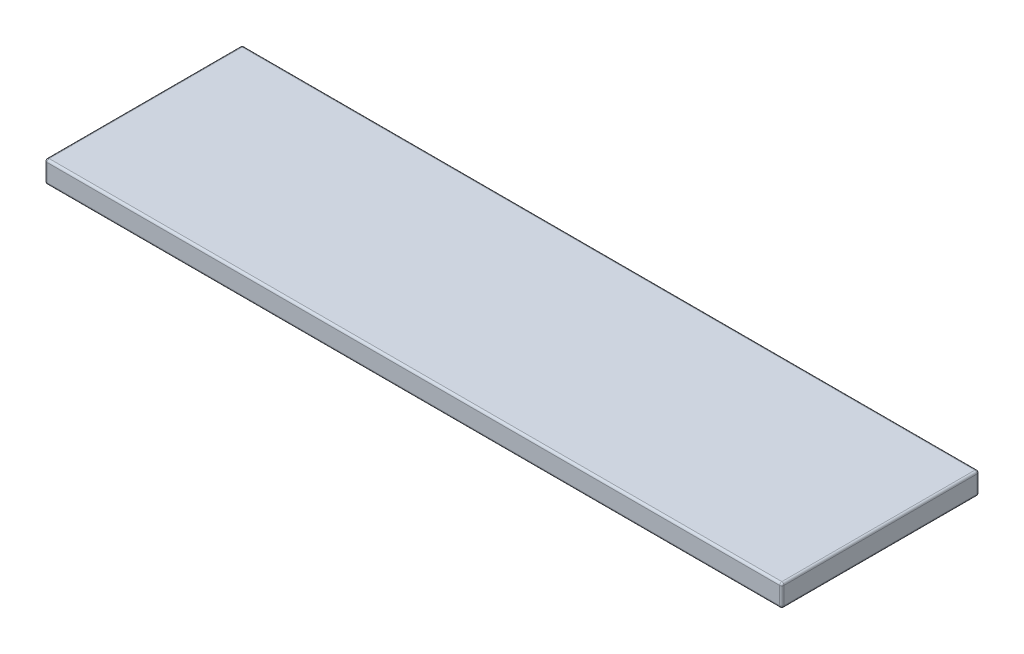
ISO-10303-21;
HEADER;
FILE_DESCRIPTION(('STEP AP214'),'2;1');
FILE_NAME('part.step','',(''),(''),'','','');
FILE_SCHEMA(('AUTOMOTIVE_DESIGN { 1 0 10303 214 1 1 1 1 }'));
ENDSEC;
DATA;
#1=APPLICATION_CONTEXT('core data for automotive mechanical design processes');
#2=APPLICATION_PROTOCOL_DEFINITION('international standard','automotive_design',2000,#1);
#3=PRODUCT_CONTEXT('',#1,'mechanical');
#4=PRODUCT('Part','Part','',(#3));
#5=PRODUCT_RELATED_PRODUCT_CATEGORY('part','',(#4));
#6=PRODUCT_DEFINITION_FORMATION('','',#4);
#7=PRODUCT_DEFINITION_CONTEXT('part definition',#1,'design');
#8=PRODUCT_DEFINITION('design','',#6,#7);
#9=PRODUCT_DEFINITION_SHAPE('','',#8);
#10=(LENGTH_UNIT() NAMED_UNIT(*) SI_UNIT(.MILLI.,.METRE.));
#11=(NAMED_UNIT(*) PLANE_ANGLE_UNIT() SI_UNIT($,.RADIAN.));
#12=(NAMED_UNIT(*) SI_UNIT($,.STERADIAN.) SOLID_ANGLE_UNIT());
#13=UNCERTAINTY_MEASURE_WITH_UNIT(LENGTH_MEASURE(1.E-05),#10,'distance_accuracy_value','');
#14=(GEOMETRIC_REPRESENTATION_CONTEXT(3) GLOBAL_UNCERTAINTY_ASSIGNED_CONTEXT((#13)) GLOBAL_UNIT_ASSIGNED_CONTEXT((#10,
#11,#12)) REPRESENTATION_CONTEXT('',''));
#15=CARTESIAN_POINT('',(0.,0.,0.));
#16=DIRECTION('',(0.,0.,1.));
#17=DIRECTION('',(1.,0.,0.));
#18=AXIS2_PLACEMENT_3D('',#15,#16,#17);
#19=CARTESIAN_POINT('',(84.,5.,22.5));
#20=DIRECTION('',(-1.,0.,0.));
#21=DIRECTION('',(0.,0.,1.));
#22=AXIS2_PLACEMENT_3D('',#19,#20,#21);
#23=PLANE('',#22);
#24=DIRECTION('',(0.,-1.,0.));
#25=VECTOR('',#24,1.);
#26=CARTESIAN_POINT('',(84.,5.,-22.));
#27=LINE('',#26,#25);
#28=CARTESIAN_POINT('',(84.,0.5,-22.));
#29=VERTEX_POINT('',#28);
#30=CARTESIAN_POINT('',(84.,4.5,-22.));
#31=VERTEX_POINT('',#30);
#32=EDGE_CURVE('E130',#29,#31,#27,.F.);
#33=ORIENTED_EDGE('',*,*,#32,.T.);
#34=DIRECTION('',(0.,0.,-1.));
#35=VECTOR('',#34,1.);
#36=CARTESIAN_POINT('',(84.,4.5,22.5));
#37=LINE('',#36,#35);
#38=CARTESIAN_POINT('',(84.,4.5,22.));
#39=VERTEX_POINT('',#38);
#40=EDGE_CURVE('E167',#31,#39,#37,.F.);
#41=ORIENTED_EDGE('',*,*,#40,.T.);
#42=DIRECTION('',(0.,-1.,0.));
#43=VECTOR('',#42,1.);
#44=CARTESIAN_POINT('',(84.,5.,22.));
#45=LINE('',#44,#43);
#46=CARTESIAN_POINT('',(84.,0.5,22.));
#47=VERTEX_POINT('',#46);
#48=EDGE_CURVE('E164',#39,#47,#45,.T.);
#49=ORIENTED_EDGE('',*,*,#48,.T.);
#50=DIRECTION('',(0.,0.,-1.));
#51=VECTOR('',#50,1.);
#52=CARTESIAN_POINT('',(84.,0.5,-22.5));
#53=LINE('',#52,#51);
#54=EDGE_CURVE('E159',#47,#29,#53,.T.);
#55=ORIENTED_EDGE('',*,*,#54,.T.);
#56=EDGE_LOOP('',(#33,#41,#49,#55));
#57=FACE_BOUND('',#56,.T.);
#58=ADVANCED_FACE('F34',(#57),#23,.F.);
#59=CARTESIAN_POINT('',(-84.,5.,-22.5));
#60=DIRECTION('',(0.,0.,1.));
#61=DIRECTION('',(1.,0.,0.));
#62=AXIS2_PLACEMENT_3D('',#59,#60,#61);
#63=PLANE('',#62);
#64=DIRECTION('',(0.,-1.,0.));
#65=VECTOR('',#64,1.);
#66=CARTESIAN_POINT('',(-83.5,5.,-22.5));
#67=LINE('',#66,#65);
#68=CARTESIAN_POINT('',(-83.5,0.5,-22.5));
#69=VERTEX_POINT('',#68);
#70=CARTESIAN_POINT('',(-83.5,4.5,-22.5));
#71=VERTEX_POINT('',#70);
#72=EDGE_CURVE('E152',#69,#71,#67,.F.);
#73=ORIENTED_EDGE('',*,*,#72,.T.);
#74=DIRECTION('',(-1.,0.,0.));
#75=VECTOR('',#74,1.);
#76=CARTESIAN_POINT('',(-84.,4.5,-22.5));
#77=LINE('',#76,#75);
#78=CARTESIAN_POINT('',(83.5,4.5,-22.5));
#79=VERTEX_POINT('',#78);
#80=EDGE_CURVE('E156',#71,#79,#77,.F.);
#81=ORIENTED_EDGE('',*,*,#80,.T.);
#82=DIRECTION('',(0.,-1.,0.));
#83=VECTOR('',#82,1.);
#84=CARTESIAN_POINT('',(83.5,5.,-22.5));
#85=LINE('',#84,#83);
#86=CARTESIAN_POINT('',(83.5,0.5,-22.5));
#87=VERTEX_POINT('',#86);
#88=EDGE_CURVE('E128',#79,#87,#85,.T.);
#89=ORIENTED_EDGE('',*,*,#88,.T.);
#90=DIRECTION('',(-1.,0.,0.));
#91=VECTOR('',#90,1.);
#92=CARTESIAN_POINT('',(-84.,0.5,-22.5));
#93=LINE('',#92,#91);
#94=EDGE_CURVE('E146',#87,#69,#93,.T.);
#95=ORIENTED_EDGE('',*,*,#94,.T.);
#96=EDGE_LOOP('',(#73,#81,#89,#95));
#97=FACE_BOUND('',#96,.T.);
#98=ADVANCED_FACE('F154',(#97),#63,.F.);
#99=CARTESIAN_POINT('',(-84.,5.,22.5));
#100=DIRECTION('',(1.,0.,0.));
#101=DIRECTION('',(0.,0.,-1.));
#102=AXIS2_PLACEMENT_3D('',#99,#100,#101);
#103=PLANE('',#102);
#104=DIRECTION('',(0.,-1.,0.));
#105=VECTOR('',#104,1.);
#106=CARTESIAN_POINT('',(-84.,5.,22.));
#107=LINE('',#106,#105);
#108=CARTESIAN_POINT('',(-84.,0.5,22.));
#109=VERTEX_POINT('',#108);
#110=CARTESIAN_POINT('',(-84.,4.5,22.));
#111=VERTEX_POINT('',#110);
#112=EDGE_CURVE('E171',#109,#111,#107,.F.);
#113=ORIENTED_EDGE('',*,*,#112,.T.);
#114=DIRECTION('',(0.,0.,1.));
#115=VECTOR('',#114,1.);
#116=CARTESIAN_POINT('',(-84.,4.5,22.5));
#117=LINE('',#116,#115);
#118=CARTESIAN_POINT('',(-84.,4.5,-22.));
#119=VERTEX_POINT('',#118);
#120=EDGE_CURVE('E176',#111,#119,#117,.F.);
#121=ORIENTED_EDGE('',*,*,#120,.T.);
#122=DIRECTION('',(0.,-1.,0.));
#123=VECTOR('',#122,1.);
#124=CARTESIAN_POINT('',(-84.,5.,-22.));
#125=LINE('',#124,#123);
#126=CARTESIAN_POINT('',(-84.,0.5,-22.));
#127=VERTEX_POINT('',#126);
#128=EDGE_CURVE('E173',#119,#127,#125,.T.);
#129=ORIENTED_EDGE('',*,*,#128,.T.);
#130=DIRECTION('',(0.,0.,1.));
#131=VECTOR('',#130,1.);
#132=CARTESIAN_POINT('',(-84.,0.5,22.5));
#133=LINE('',#132,#131);
#134=EDGE_CURVE('E169',#127,#109,#133,.T.);
#135=ORIENTED_EDGE('',*,*,#134,.T.);
#136=EDGE_LOOP('',(#113,#121,#129,#135));
#137=FACE_BOUND('',#136,.T.);
#138=ADVANCED_FACE('F281',(#137),#103,.F.);
#139=CARTESIAN_POINT('',(-84.,5.,22.5));
#140=DIRECTION('',(0.,0.,-1.));
#141=DIRECTION('',(-1.,0.,0.));
#142=AXIS2_PLACEMENT_3D('',#139,#140,#141);
#143=PLANE('',#142);
#144=DIRECTION('',(0.,-1.,0.));
#145=VECTOR('',#144,1.);
#146=CARTESIAN_POINT('',(83.5,5.,22.5));
#147=LINE('',#146,#145);
#148=CARTESIAN_POINT('',(83.5,0.5,22.5));
#149=VERTEX_POINT('',#148);
#150=CARTESIAN_POINT('',(83.5,4.5,22.5));
#151=VERTEX_POINT('',#150);
#152=EDGE_CURVE('E180',#149,#151,#147,.F.);
#153=ORIENTED_EDGE('',*,*,#152,.T.);
#154=DIRECTION('',(1.,0.,0.));
#155=VECTOR('',#154,1.);
#156=CARTESIAN_POINT('',(-84.,4.5,22.5));
#157=LINE('',#156,#155);
#158=CARTESIAN_POINT('',(-83.5,4.5,22.5));
#159=VERTEX_POINT('',#158);
#160=EDGE_CURVE('E185',#151,#159,#157,.F.);
#161=ORIENTED_EDGE('',*,*,#160,.T.);
#162=DIRECTION('',(0.,-1.,0.));
#163=VECTOR('',#162,1.);
#164=CARTESIAN_POINT('',(-83.5,5.,22.5));
#165=LINE('',#164,#163);
#166=CARTESIAN_POINT('',(-83.5,0.5,22.5));
#167=VERTEX_POINT('',#166);
#168=EDGE_CURVE('E182',#159,#167,#165,.T.);
#169=ORIENTED_EDGE('',*,*,#168,.T.);
#170=DIRECTION('',(1.,0.,0.));
#171=VECTOR('',#170,1.);
#172=CARTESIAN_POINT('',(84.,0.5,22.5));
#173=LINE('',#172,#171);
#174=EDGE_CURVE('E178',#167,#149,#173,.T.);
#175=ORIENTED_EDGE('',*,*,#174,.T.);
#176=EDGE_LOOP('',(#153,#161,#169,#175));
#177=FACE_BOUND('',#176,.T.);
#178=ADVANCED_FACE('F292',(#177),#143,.F.);
#179=CARTESIAN_POINT('',(0.,5.,0.));
#180=DIRECTION('',(0.,-1.,0.));
#181=DIRECTION('',(0.,0.,-1.));
#182=AXIS2_PLACEMENT_3D('',#179,#180,#181);
#183=PLANE('',#182);
#184=DIRECTION('',(0.,0.,1.));
#185=VECTOR('',#184,1.);
#186=CARTESIAN_POINT('',(-83.5,5.,0.));
#187=LINE('',#186,#185);
#188=CARTESIAN_POINT('',(-83.5,5.,-22.));
#189=VERTEX_POINT('',#188);
#190=CARTESIAN_POINT('',(-83.5,5.,22.));
#191=VERTEX_POINT('',#190);
#192=EDGE_CURVE('E191',#189,#191,#187,.T.);
#193=ORIENTED_EDGE('',*,*,#192,.T.);
#194=DIRECTION('',(1.,0.,0.));
#195=VECTOR('',#194,1.);
#196=CARTESIAN_POINT('',(0.,5.,22.));
#197=LINE('',#196,#195);
#198=CARTESIAN_POINT('',(83.5,5.,22.));
#199=VERTEX_POINT('',#198);
#200=EDGE_CURVE('E193',#191,#199,#197,.T.);
#201=ORIENTED_EDGE('',*,*,#200,.T.);
#202=DIRECTION('',(0.,0.,-1.));
#203=VECTOR('',#202,1.);
#204=CARTESIAN_POINT('',(83.5,5.,0.));
#205=LINE('',#204,#203);
#206=CARTESIAN_POINT('',(83.5,5.,-22.));
#207=VERTEX_POINT('',#206);
#208=EDGE_CURVE('E187',#199,#207,#205,.T.);
#209=ORIENTED_EDGE('',*,*,#208,.T.);
#210=DIRECTION('',(-1.,0.,0.));
#211=VECTOR('',#210,1.);
#212=CARTESIAN_POINT('',(0.,5.,-22.));
#213=LINE('',#212,#211);
#214=EDGE_CURVE('E189',#207,#189,#213,.T.);
#215=ORIENTED_EDGE('',*,*,#214,.T.);
#216=EDGE_LOOP('',(#193,#201,#209,#215));
#217=FACE_BOUND('',#216,.T.);
#218=ADVANCED_FACE('F273',(#217),#183,.F.);
#219=CARTESIAN_POINT('',(0.,0.,0.));
#220=DIRECTION('',(0.,-1.,0.));
#221=DIRECTION('',(0.,0.,-1.));
#222=AXIS2_PLACEMENT_3D('',#219,#220,#221);
#223=PLANE('',#222);
#224=DIRECTION('',(0.,0.,1.));
#225=VECTOR('',#224,1.);
#226=CARTESIAN_POINT('',(-83.5,0.,-22.5));
#227=LINE('',#226,#225);
#228=CARTESIAN_POINT('',(-83.5,0.,22.));
#229=VERTEX_POINT('',#228);
#230=CARTESIAN_POINT('',(-83.5,0.,-22.));
#231=VERTEX_POINT('',#230);
#232=EDGE_CURVE('E43',#229,#231,#227,.F.);
#233=ORIENTED_EDGE('',*,*,#232,.T.);
#234=DIRECTION('',(-1.,0.,0.));
#235=VECTOR('',#234,1.);
#236=CARTESIAN_POINT('',(84.,0.,-22.));
#237=LINE('',#236,#235);
#238=CARTESIAN_POINT('',(83.5,0.,-22.));
#239=VERTEX_POINT('',#238);
#240=EDGE_CURVE('E11',#231,#239,#237,.F.);
#241=ORIENTED_EDGE('',*,*,#240,.T.);
#242=DIRECTION('',(0.,0.,-1.));
#243=VECTOR('',#242,1.);
#244=CARTESIAN_POINT('',(83.5,0.,22.5));
#245=LINE('',#244,#243);
#246=CARTESIAN_POINT('',(83.5,0.,22.));
#247=VERTEX_POINT('',#246);
#248=EDGE_CURVE('E196',#239,#247,#245,.F.);
#249=ORIENTED_EDGE('',*,*,#248,.T.);
#250=DIRECTION('',(1.,0.,0.));
#251=VECTOR('',#250,1.);
#252=CARTESIAN_POINT('',(-84.,0.,22.));
#253=LINE('',#252,#251);
#254=EDGE_CURVE('E54',#247,#229,#253,.F.);
#255=ORIENTED_EDGE('',*,*,#254,.T.);
#256=EDGE_LOOP('',(#233,#241,#249,#255));
#257=FACE_BOUND('',#256,.T.);
#258=ADVANCED_FACE('F479',(#257),#223,.T.);
#259=CARTESIAN_POINT('',(-83.5,5.,22.));
#260=DIRECTION('',(0.,-1.,0.));
#261=DIRECTION('',(0.,0.,-1.));
#262=AXIS2_PLACEMENT_3D('',#259,#260,#261);
#263=CYLINDRICAL_SURFACE('',#262,0.5);
#264=CARTESIAN_POINT('',(-83.5,4.5,22.));
#265=DIRECTION('',(0.,1.,0.));
#266=DIRECTION('',(0.,0.,1.));
#267=AXIS2_PLACEMENT_3D('',#264,#265,#266);
#268=CIRCLE('',#267,0.5);
#269=EDGE_CURVE('E38',#111,#159,#268,.T.);
#270=ORIENTED_EDGE('',*,*,#269,.F.);
#271=ORIENTED_EDGE('',*,*,#112,.F.);
#272=CARTESIAN_POINT('',(-83.5,0.5,22.));
#273=DIRECTION('',(0.,-1.,0.));
#274=DIRECTION('',(0.,0.,-1.));
#275=AXIS2_PLACEMENT_3D('',#272,#273,#274);
#276=CIRCLE('',#275,0.5);
#277=EDGE_CURVE('E250',#167,#109,#276,.T.);
#278=ORIENTED_EDGE('',*,*,#277,.F.);
#279=ORIENTED_EDGE('',*,*,#168,.F.);
#280=EDGE_LOOP('',(#270,#271,#278,#279));
#281=FACE_BOUND('',#280,.T.);
#282=ADVANCED_FACE('F36',(#281),#263,.T.);
#283=CARTESIAN_POINT('',(-83.5,4.5,22.));
#284=DIRECTION('',(0.,0.,1.));
#285=DIRECTION('',(1.,0.,0.));
#286=AXIS2_PLACEMENT_3D('',#283,#284,#285);
#287=SPHERICAL_SURFACE('',#286,0.5);
#288=CARTESIAN_POINT('',(-83.5,4.5,22.));
#289=DIRECTION('',(0.,0.,1.));
#290=DIRECTION('',(1.,0.,0.));
#291=AXIS2_PLACEMENT_3D('',#288,#289,#290);
#292=CIRCLE('',#291,0.5);
#293=EDGE_CURVE('E245',#111,#191,#292,.F.);
#294=ORIENTED_EDGE('',*,*,#293,.F.);
#295=ORIENTED_EDGE('',*,*,#269,.T.);
#296=CARTESIAN_POINT('',(-83.5,4.5,22.));
#297=DIRECTION('',(-1.,0.,0.));
#298=DIRECTION('',(0.,0.,1.));
#299=AXIS2_PLACEMENT_3D('',#296,#297,#298);
#300=CIRCLE('',#299,0.5);
#301=EDGE_CURVE('E248',#191,#159,#300,.F.);
#302=ORIENTED_EDGE('',*,*,#301,.F.);
#303=EDGE_LOOP('',(#294,#295,#302));
#304=FACE_BOUND('',#303,.T.);
#305=ADVANCED_FACE('F261',(#304),#287,.T.);
#306=CARTESIAN_POINT('',(-83.5,0.5,22.));
#307=DIRECTION('',(0.,0.,1.));
#308=DIRECTION('',(1.,0.,0.));
#309=AXIS2_PLACEMENT_3D('',#306,#307,#308);
#310=SPHERICAL_SURFACE('',#309,0.5);
#311=CARTESIAN_POINT('',(-83.5,0.5,22.));
#312=DIRECTION('',(-1.,0.,0.));
#313=DIRECTION('',(0.,0.,1.));
#314=AXIS2_PLACEMENT_3D('',#311,#312,#313);
#315=CIRCLE('',#314,0.5);
#316=EDGE_CURVE('E240',#167,#229,#315,.F.);
#317=ORIENTED_EDGE('',*,*,#316,.F.);
#318=ORIENTED_EDGE('',*,*,#277,.T.);
#319=CARTESIAN_POINT('',(-83.5,0.5,22.));
#320=DIRECTION('',(0.,0.,1.));
#321=DIRECTION('',(1.,0.,0.));
#322=AXIS2_PLACEMENT_3D('',#319,#320,#321);
#323=CIRCLE('',#322,0.5);
#324=EDGE_CURVE('E242',#229,#109,#323,.F.);
#325=ORIENTED_EDGE('',*,*,#324,.F.);
#326=EDGE_LOOP('',(#317,#318,#325));
#327=FACE_BOUND('',#326,.T.);
#328=ADVANCED_FACE('F458',(#327),#310,.T.);
#329=CARTESIAN_POINT('',(0.,4.5,22.));
#330=DIRECTION('',(1.,0.,0.));
#331=DIRECTION('',(0.,0.,-1.));
#332=AXIS2_PLACEMENT_3D('',#329,#330,#331);
#333=CYLINDRICAL_SURFACE('',#332,0.5);
#334=ORIENTED_EDGE('',*,*,#301,.T.);
#335=ORIENTED_EDGE('',*,*,#160,.F.);
#336=CARTESIAN_POINT('',(83.5,4.5,22.));
#337=DIRECTION('',(1.,0.,0.));
#338=DIRECTION('',(0.,0.,-1.));
#339=AXIS2_PLACEMENT_3D('',#336,#337,#338);
#340=CIRCLE('',#339,0.5);
#341=EDGE_CURVE('E234',#199,#151,#340,.T.);
#342=ORIENTED_EDGE('',*,*,#341,.F.);
#343=ORIENTED_EDGE('',*,*,#200,.F.);
#344=EDGE_LOOP('',(#334,#335,#342,#343));
#345=FACE_BOUND('',#344,.T.);
#346=ADVANCED_FACE('F269',(#345),#333,.T.);
#347=CARTESIAN_POINT('',(-83.5,4.5,0.));
#348=DIRECTION('',(0.,0.,1.));
#349=DIRECTION('',(1.,0.,0.));
#350=AXIS2_PLACEMENT_3D('',#347,#348,#349);
#351=CYLINDRICAL_SURFACE('',#350,0.5);
#352=ORIENTED_EDGE('',*,*,#293,.T.);
#353=ORIENTED_EDGE('',*,*,#192,.F.);
#354=CARTESIAN_POINT('',(-83.5,4.5,-22.));
#355=DIRECTION('',(0.,0.,-1.));
#356=DIRECTION('',(-1.,0.,0.));
#357=AXIS2_PLACEMENT_3D('',#354,#355,#356);
#358=CIRCLE('',#357,0.5);
#359=EDGE_CURVE('E231',#119,#189,#358,.T.);
#360=ORIENTED_EDGE('',*,*,#359,.F.);
#361=ORIENTED_EDGE('',*,*,#120,.F.);
#362=EDGE_LOOP('',(#352,#353,#360,#361));
#363=FACE_BOUND('',#362,.T.);
#364=ADVANCED_FACE('F278',(#363),#351,.T.);
#365=CARTESIAN_POINT('',(-83.5,5.,-22.));
#366=DIRECTION('',(0.,-1.,0.));
#367=DIRECTION('',(0.,0.,-1.));
#368=AXIS2_PLACEMENT_3D('',#365,#366,#367);
#369=CYLINDRICAL_SURFACE('',#368,0.5);
#370=CARTESIAN_POINT('',(-83.5,0.5,-22.));
#371=DIRECTION('',(0.,-1.,0.));
#372=DIRECTION('',(0.,0.,-1.));
#373=AXIS2_PLACEMENT_3D('',#370,#371,#372);
#374=CIRCLE('',#373,0.5);
#375=EDGE_CURVE('E225',#127,#69,#374,.T.);
#376=ORIENTED_EDGE('',*,*,#375,.F.);
#377=ORIENTED_EDGE('',*,*,#128,.F.);
#378=CARTESIAN_POINT('',(-83.5,4.5,-22.));
#379=DIRECTION('',(0.,1.,0.));
#380=DIRECTION('',(0.,0.,1.));
#381=AXIS2_PLACEMENT_3D('',#378,#379,#380);
#382=CIRCLE('',#381,0.5);
#383=EDGE_CURVE('E228',#71,#119,#382,.T.);
#384=ORIENTED_EDGE('',*,*,#383,.F.);
#385=ORIENTED_EDGE('',*,*,#72,.F.);
#386=EDGE_LOOP('',(#376,#377,#384,#385));
#387=FACE_BOUND('',#386,.T.);
#388=ADVANCED_FACE('F285',(#387),#369,.T.);
#389=CARTESIAN_POINT('',(-83.5,0.5,22.5));
#390=DIRECTION('',(0.,0.,-1.));
#391=DIRECTION('',(-1.,0.,0.));
#392=AXIS2_PLACEMENT_3D('',#389,#390,#391);
#393=CYLINDRICAL_SURFACE('',#392,0.5);
#394=ORIENTED_EDGE('',*,*,#324,.T.);
#395=ORIENTED_EDGE('',*,*,#134,.F.);
#396=CARTESIAN_POINT('',(-83.5,0.5,-22.));
#397=DIRECTION('',(0.,0.,-1.));
#398=DIRECTION('',(-1.,0.,0.));
#399=AXIS2_PLACEMENT_3D('',#396,#397,#398);
#400=CIRCLE('',#399,0.5);
#401=EDGE_CURVE('E223',#231,#127,#400,.T.);
#402=ORIENTED_EDGE('',*,*,#401,.F.);
#403=ORIENTED_EDGE('',*,*,#232,.F.);
#404=EDGE_LOOP('',(#394,#395,#402,#403));
#405=FACE_BOUND('',#404,.T.);
#406=ADVANCED_FACE('F290',(#405),#393,.T.);
#407=CARTESIAN_POINT('',(-84.,0.5,22.));
#408=DIRECTION('',(-1.,0.,0.));
#409=DIRECTION('',(0.,0.,1.));
#410=AXIS2_PLACEMENT_3D('',#407,#408,#409);
#411=CYLINDRICAL_SURFACE('',#410,0.5);
#412=ORIENTED_EDGE('',*,*,#316,.T.);
#413=ORIENTED_EDGE('',*,*,#254,.F.);
#414=CARTESIAN_POINT('',(83.5,0.5,22.));
#415=DIRECTION('',(1.,0.,0.));
#416=DIRECTION('',(0.,0.,-1.));
#417=AXIS2_PLACEMENT_3D('',#414,#415,#416);
#418=CIRCLE('',#417,0.5);
#419=EDGE_CURVE('E220',#149,#247,#418,.T.);
#420=ORIENTED_EDGE('',*,*,#419,.F.);
#421=ORIENTED_EDGE('',*,*,#174,.F.);
#422=EDGE_LOOP('',(#412,#413,#420,#421));
#423=FACE_BOUND('',#422,.T.);
#424=ADVANCED_FACE('F301',(#423),#411,.T.);
#425=CARTESIAN_POINT('',(83.5,5.,22.));
#426=DIRECTION('',(0.,-1.,0.));
#427=DIRECTION('',(0.,0.,-1.));
#428=AXIS2_PLACEMENT_3D('',#425,#426,#427);
#429=CYLINDRICAL_SURFACE('',#428,0.5);
#430=CARTESIAN_POINT('',(83.5,4.5,22.));
#431=DIRECTION('',(0.,1.,0.));
#432=DIRECTION('',(0.,0.,1.));
#433=AXIS2_PLACEMENT_3D('',#430,#431,#432);
#434=CIRCLE('',#433,0.5);
#435=EDGE_CURVE('E237',#151,#39,#434,.T.);
#436=ORIENTED_EDGE('',*,*,#435,.F.);
#437=ORIENTED_EDGE('',*,*,#152,.F.);
#438=CARTESIAN_POINT('',(83.5,0.5,22.));
#439=DIRECTION('',(0.,-1.,0.));
#440=DIRECTION('',(0.,0.,-1.));
#441=AXIS2_PLACEMENT_3D('',#438,#439,#440);
#442=CIRCLE('',#441,0.5);
#443=EDGE_CURVE('E217',#47,#149,#442,.T.);
#444=ORIENTED_EDGE('',*,*,#443,.F.);
#445=ORIENTED_EDGE('',*,*,#48,.F.);
#446=EDGE_LOOP('',(#436,#437,#444,#445));
#447=FACE_BOUND('',#446,.T.);
#448=ADVANCED_FACE('F297',(#447),#429,.T.);
#449=CARTESIAN_POINT('',(83.5,4.5,22.));
#450=DIRECTION('',(0.,0.,1.));
#451=DIRECTION('',(1.,0.,0.));
#452=AXIS2_PLACEMENT_3D('',#449,#450,#451);
#453=SPHERICAL_SURFACE('',#452,0.5);
#454=ORIENTED_EDGE('',*,*,#341,.T.);
#455=ORIENTED_EDGE('',*,*,#435,.T.);
#456=CARTESIAN_POINT('',(83.5,4.5,22.));
#457=DIRECTION('',(0.,0.,1.));
#458=DIRECTION('',(1.,0.,0.));
#459=AXIS2_PLACEMENT_3D('',#456,#457,#458);
#460=CIRCLE('',#459,0.5);
#461=EDGE_CURVE('E214',#199,#39,#460,.F.);
#462=ORIENTED_EDGE('',*,*,#461,.F.);
#463=EDGE_LOOP('',(#454,#455,#462));
#464=FACE_BOUND('',#463,.T.);
#465=ADVANCED_FACE('F311',(#464),#453,.T.);
#466=CARTESIAN_POINT('',(-83.5,4.5,-22.));
#467=DIRECTION('',(0.,0.,1.));
#468=DIRECTION('',(1.,0.,0.));
#469=AXIS2_PLACEMENT_3D('',#466,#467,#468);
#470=SPHERICAL_SURFACE('',#469,0.5);
#471=ORIENTED_EDGE('',*,*,#383,.T.);
#472=ORIENTED_EDGE('',*,*,#359,.T.);
#473=CARTESIAN_POINT('',(-83.5,4.5,-22.));
#474=DIRECTION('',(-1.,0.,0.));
#475=DIRECTION('',(0.,0.,1.));
#476=AXIS2_PLACEMENT_3D('',#473,#474,#475);
#477=CIRCLE('',#476,0.5);
#478=EDGE_CURVE('E211',#71,#189,#477,.F.);
#479=ORIENTED_EDGE('',*,*,#478,.F.);
#480=EDGE_LOOP('',(#471,#472,#479));
#481=FACE_BOUND('',#480,.T.);
#482=ADVANCED_FACE('F321',(#481),#470,.T.);
#483=CARTESIAN_POINT('',(-83.5,0.5,-22.));
#484=DIRECTION('',(0.,0.,1.));
#485=DIRECTION('',(1.,0.,0.));
#486=AXIS2_PLACEMENT_3D('',#483,#484,#485);
#487=SPHERICAL_SURFACE('',#486,0.5);
#488=ORIENTED_EDGE('',*,*,#401,.T.);
#489=ORIENTED_EDGE('',*,*,#375,.T.);
#490=CARTESIAN_POINT('',(-83.5,0.5,-22.));
#491=DIRECTION('',(-1.,0.,0.));
#492=DIRECTION('',(0.,0.,1.));
#493=AXIS2_PLACEMENT_3D('',#490,#491,#492);
#494=CIRCLE('',#493,0.5);
#495=EDGE_CURVE('E149',#231,#69,#494,.F.);
#496=ORIENTED_EDGE('',*,*,#495,.F.);
#497=EDGE_LOOP('',(#488,#489,#496));
#498=FACE_BOUND('',#497,.T.);
#499=ADVANCED_FACE('F323',(#498),#487,.T.);
#500=CARTESIAN_POINT('',(83.5,0.5,22.));
#501=DIRECTION('',(0.,0.,1.));
#502=DIRECTION('',(1.,0.,0.));
#503=AXIS2_PLACEMENT_3D('',#500,#501,#502);
#504=SPHERICAL_SURFACE('',#503,0.5);
#505=ORIENTED_EDGE('',*,*,#443,.T.);
#506=ORIENTED_EDGE('',*,*,#419,.T.);
#507=CARTESIAN_POINT('',(83.5,0.5,22.));
#508=DIRECTION('',(0.,0.,1.));
#509=DIRECTION('',(1.,0.,0.));
#510=AXIS2_PLACEMENT_3D('',#507,#508,#509);
#511=CIRCLE('',#510,0.5);
#512=EDGE_CURVE('E207',#47,#247,#511,.F.);
#513=ORIENTED_EDGE('',*,*,#512,.F.);
#514=EDGE_LOOP('',(#505,#506,#513));
#515=FACE_BOUND('',#514,.T.);
#516=ADVANCED_FACE('F303',(#515),#504,.T.);
#517=CARTESIAN_POINT('',(83.5,4.5,0.));
#518=DIRECTION('',(0.,0.,-1.));
#519=DIRECTION('',(-1.,0.,0.));
#520=AXIS2_PLACEMENT_3D('',#517,#518,#519);
#521=CYLINDRICAL_SURFACE('',#520,0.5);
#522=ORIENTED_EDGE('',*,*,#461,.T.);
#523=ORIENTED_EDGE('',*,*,#40,.F.);
#524=CARTESIAN_POINT('',(83.5,4.5,-22.));
#525=DIRECTION('',(0.,0.,-1.));
#526=DIRECTION('',(-1.,0.,0.));
#527=AXIS2_PLACEMENT_3D('',#524,#525,#526);
#528=CIRCLE('',#527,0.5);
#529=EDGE_CURVE('E204',#207,#31,#528,.T.);
#530=ORIENTED_EDGE('',*,*,#529,.F.);
#531=ORIENTED_EDGE('',*,*,#208,.F.);
#532=EDGE_LOOP('',(#522,#523,#530,#531));
#533=FACE_BOUND('',#532,.T.);
#534=ADVANCED_FACE('F313',(#533),#521,.T.);
#535=CARTESIAN_POINT('',(0.,4.5,-22.));
#536=DIRECTION('',(-1.,0.,0.));
#537=DIRECTION('',(0.,0.,1.));
#538=AXIS2_PLACEMENT_3D('',#535,#536,#537);
#539=CYLINDRICAL_SURFACE('',#538,0.5);
#540=ORIENTED_EDGE('',*,*,#478,.T.);
#541=ORIENTED_EDGE('',*,*,#214,.F.);
#542=CARTESIAN_POINT('',(83.5,4.5,-22.));
#543=DIRECTION('',(1.,0.,0.));
#544=DIRECTION('',(0.,0.,-1.));
#545=AXIS2_PLACEMENT_3D('',#542,#543,#544);
#546=CIRCLE('',#545,0.5);
#547=EDGE_CURVE('E143',#79,#207,#546,.T.);
#548=ORIENTED_EDGE('',*,*,#547,.F.);
#549=ORIENTED_EDGE('',*,*,#80,.F.);
#550=EDGE_LOOP('',(#540,#541,#548,#549));
#551=FACE_BOUND('',#550,.T.);
#552=ADVANCED_FACE('F319',(#551),#539,.T.);
#553=CARTESIAN_POINT('',(-84.,0.5,-22.));
#554=DIRECTION('',(1.,0.,0.));
#555=DIRECTION('',(0.,0.,-1.));
#556=AXIS2_PLACEMENT_3D('',#553,#554,#555);
#557=CYLINDRICAL_SURFACE('',#556,0.5);
#558=ORIENTED_EDGE('',*,*,#495,.T.);
#559=ORIENTED_EDGE('',*,*,#94,.F.);
#560=CARTESIAN_POINT('',(83.5,0.5,-22.));
#561=DIRECTION('',(1.,0.,0.));
#562=DIRECTION('',(0.,0.,-1.));
#563=AXIS2_PLACEMENT_3D('',#560,#561,#562);
#564=CIRCLE('',#563,0.5);
#565=EDGE_CURVE('E135',#239,#87,#564,.T.);
#566=ORIENTED_EDGE('',*,*,#565,.F.);
#567=ORIENTED_EDGE('',*,*,#240,.F.);
#568=EDGE_LOOP('',(#558,#559,#566,#567));
#569=FACE_BOUND('',#568,.T.);
#570=ADVANCED_FACE('F147',(#569),#557,.T.);
#571=CARTESIAN_POINT('',(83.5,0.5,22.5));
#572=DIRECTION('',(0.,0.,1.));
#573=DIRECTION('',(1.,0.,0.));
#574=AXIS2_PLACEMENT_3D('',#571,#572,#573);
#575=CYLINDRICAL_SURFACE('',#574,0.5);
#576=ORIENTED_EDGE('',*,*,#512,.T.);
#577=ORIENTED_EDGE('',*,*,#248,.F.);
#578=CARTESIAN_POINT('',(83.5,0.5,-22.));
#579=DIRECTION('',(0.,0.,-1.));
#580=DIRECTION('',(-1.,0.,0.));
#581=AXIS2_PLACEMENT_3D('',#578,#579,#580);
#582=CIRCLE('',#581,0.5);
#583=EDGE_CURVE('E139',#29,#239,#582,.T.);
#584=ORIENTED_EDGE('',*,*,#583,.F.);
#585=ORIENTED_EDGE('',*,*,#54,.F.);
#586=EDGE_LOOP('',(#576,#577,#584,#585));
#587=FACE_BOUND('',#586,.T.);
#588=ADVANCED_FACE('F306',(#587),#575,.T.);
#589=CARTESIAN_POINT('',(83.5,4.5,-22.));
#590=DIRECTION('',(0.,0.,1.));
#591=DIRECTION('',(1.,0.,0.));
#592=AXIS2_PLACEMENT_3D('',#589,#590,#591);
#593=SPHERICAL_SURFACE('',#592,0.5);
#594=ORIENTED_EDGE('',*,*,#547,.T.);
#595=ORIENTED_EDGE('',*,*,#529,.T.);
#596=CARTESIAN_POINT('',(83.5,4.5,-22.));
#597=DIRECTION('',(0.,1.,0.));
#598=DIRECTION('',(0.,0.,1.));
#599=AXIS2_PLACEMENT_3D('',#596,#597,#598);
#600=CIRCLE('',#599,0.5);
#601=EDGE_CURVE('E132',#79,#31,#600,.F.);
#602=ORIENTED_EDGE('',*,*,#601,.F.);
#603=EDGE_LOOP('',(#594,#595,#602));
#604=FACE_BOUND('',#603,.T.);
#605=ADVANCED_FACE('F317',(#604),#593,.T.);
#606=CARTESIAN_POINT('',(83.5,0.5,-22.));
#607=DIRECTION('',(0.,0.,1.));
#608=DIRECTION('',(1.,0.,0.));
#609=AXIS2_PLACEMENT_3D('',#606,#607,#608);
#610=SPHERICAL_SURFACE('',#609,0.5);
#611=ORIENTED_EDGE('',*,*,#583,.T.);
#612=ORIENTED_EDGE('',*,*,#565,.T.);
#613=CARTESIAN_POINT('',(83.5,0.5,-22.));
#614=DIRECTION('',(0.,-1.,0.));
#615=DIRECTION('',(0.,0.,-1.));
#616=AXIS2_PLACEMENT_3D('',#613,#614,#615);
#617=CIRCLE('',#616,0.5);
#618=EDGE_CURVE('E124',#29,#87,#617,.F.);
#619=ORIENTED_EDGE('',*,*,#618,.F.);
#620=EDGE_LOOP('',(#611,#612,#619));
#621=FACE_BOUND('',#620,.T.);
#622=ADVANCED_FACE('F137',(#621),#610,.T.);
#623=CARTESIAN_POINT('',(83.5,5.,-22.));
#624=DIRECTION('',(0.,-1.,0.));
#625=DIRECTION('',(0.,0.,-1.));
#626=AXIS2_PLACEMENT_3D('',#623,#624,#625);
#627=CYLINDRICAL_SURFACE('',#626,0.5);
#628=ORIENTED_EDGE('',*,*,#601,.T.);
#629=ORIENTED_EDGE('',*,*,#32,.F.);
#630=ORIENTED_EDGE('',*,*,#618,.T.);
#631=ORIENTED_EDGE('',*,*,#88,.F.);
#632=EDGE_LOOP('',(#628,#629,#630,#631));
#633=FACE_BOUND('',#632,.T.);
#634=ADVANCED_FACE('F126',(#633),#627,.T.);
#635=CLOSED_SHELL('',(#58,#98,#138,#178,#218,#258,#282,#305,#328,#346,#364,#388,#406,#424,#448,
#465,#482,#499,#516,#534,#552,#570,#588,#605,#622,#634));
#636=MANIFOLD_SOLID_BREP('B2',#635);
#637=ADVANCED_BREP_SHAPE_REPRESENTATION('',(#18,#636),#14);
#638=SHAPE_DEFINITION_REPRESENTATION(#9,#637);
ENDSEC;
END-ISO-10303-21;
